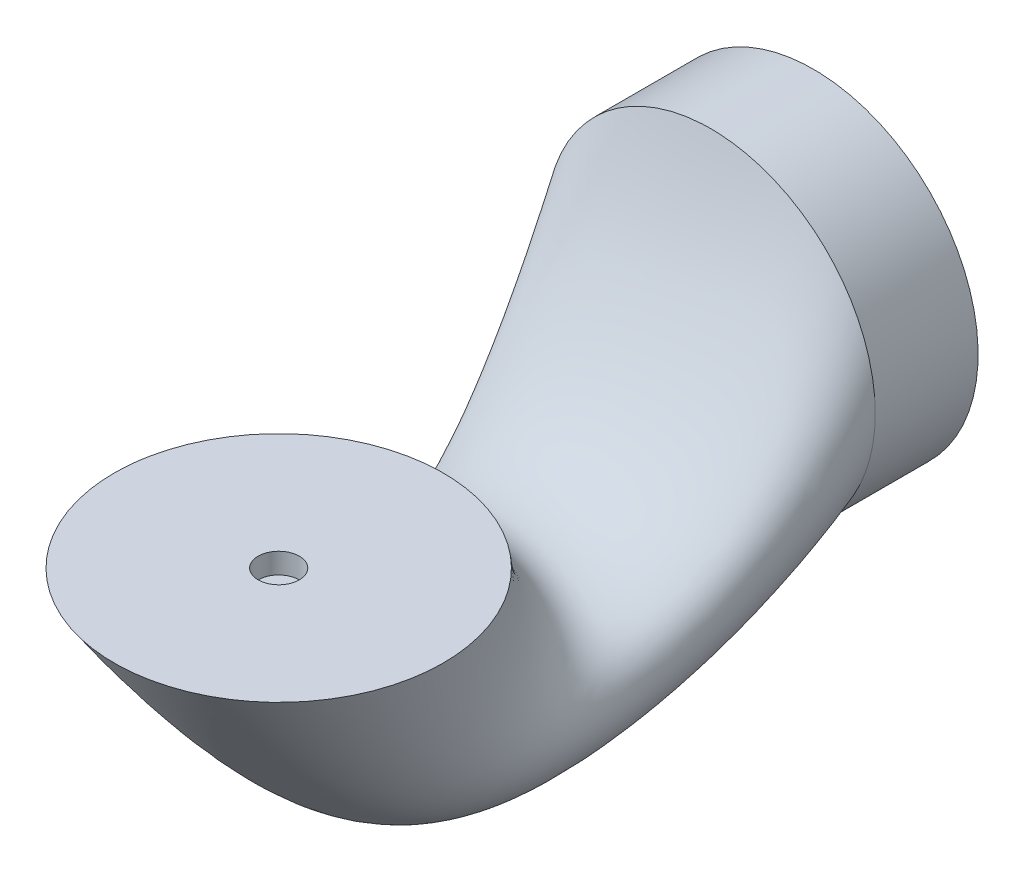
ISO-10303-21;
HEADER;
FILE_DESCRIPTION(('STEP AP214'),'2;1');
FILE_NAME('part.step','',(''),(''),'','','');
FILE_SCHEMA(('AUTOMOTIVE_DESIGN { 1 0 10303 214 1 1 1 1 }'));
ENDSEC;
DATA;
#1=APPLICATION_CONTEXT('core data for automotive mechanical design processes');
#2=APPLICATION_PROTOCOL_DEFINITION('international standard','automotive_design',2000,#1);
#3=PRODUCT_CONTEXT('',#1,'mechanical');
#4=PRODUCT('Part','Part','',(#3));
#5=PRODUCT_RELATED_PRODUCT_CATEGORY('part','',(#4));
#6=PRODUCT_DEFINITION_FORMATION('','',#4);
#7=PRODUCT_DEFINITION_CONTEXT('part definition',#1,'design');
#8=PRODUCT_DEFINITION('design','',#6,#7);
#9=PRODUCT_DEFINITION_SHAPE('','',#8);
#10=(LENGTH_UNIT() NAMED_UNIT(*) SI_UNIT(.MILLI.,.METRE.));
#11=(NAMED_UNIT(*) PLANE_ANGLE_UNIT() SI_UNIT($,.RADIAN.));
#12=(NAMED_UNIT(*) SI_UNIT($,.STERADIAN.) SOLID_ANGLE_UNIT());
#13=UNCERTAINTY_MEASURE_WITH_UNIT(LENGTH_MEASURE(1.E-05),#10,'distance_accuracy_value','');
#14=(GEOMETRIC_REPRESENTATION_CONTEXT(3) GLOBAL_UNCERTAINTY_ASSIGNED_CONTEXT((#13)) GLOBAL_UNIT_ASSIGNED_CONTEXT((#10,
#11,#12)) REPRESENTATION_CONTEXT('',''));
#15=CARTESIAN_POINT('',(0.,0.,0.));
#16=DIRECTION('',(0.,0.,1.));
#17=DIRECTION('',(1.,0.,0.));
#18=AXIS2_PLACEMENT_3D('',#15,#16,#17);
#19=CARTESIAN_POINT('',(0.,0.,260.));
#20=DIRECTION('',(0.,1.,0.));
#21=DIRECTION('',(0.,0.,1.));
#22=AXIS2_PLACEMENT_3D('',#19,#20,#21);
#23=PLANE('',#22);
#24=CARTESIAN_POINT('',(0.,0.,260.));
#25=DIRECTION('',(0.,1.,0.));
#26=DIRECTION('',(0.,0.,1.));
#27=AXIS2_PLACEMENT_3D('',#24,#25,#26);
#28=CIRCLE('',#27,10.);
#29=CARTESIAN_POINT('',(0.,0.,270.));
#30=VERTEX_POINT('',#29);
#31=EDGE_CURVE('E111',#30,#30,#28,.T.);
#32=ORIENTED_EDGE('',*,*,#31,.F.);
#33=EDGE_LOOP('',(#32));
#34=FACE_BOUND('',#33,.T.);
#35=CARTESIAN_POINT('',(-78.4955339615384,0.,244.558136508408));
#36=CARTESIAN_POINT('',(-78.2907679151548,0.,243.517250467884));
#37=CARTESIAN_POINT('',(-77.8407206554618,0.,241.447868670442));
#38=CARTESIAN_POINT('',(-77.0461181703535,0.,238.383994638859));
#39=CARTESIAN_POINT('',(-76.1339979948852,0.,235.363347085615));
#40=CARTESIAN_POINT('',(-69.9682542311678,0.,217.516987518738));
#41=CARTESIAN_POINT('',(-58.6786225704238,0.,203.035847137751));
#42=CARTESIAN_POINT('',(-26.9694972149722,0.,181.751706899031));
#43=CARTESIAN_POINT('',(-5.37585731888476,0.,177.40914511079));
#44=CARTESIAN_POINT('',(36.2595843020694,0.,185.599786966134));
#45=CARTESIAN_POINT('',(54.59924839128,0.,197.798141278971));
#46=CARTESIAN_POINT('',(78.2482931009694,0.,233.030502785028));
#47=CARTESIAN_POINT('',(82.5908548892102,0.,254.624142681115));
#48=CARTESIAN_POINT('',(74.4002130338665,0.,296.259584302069));
#49=CARTESIAN_POINT('',(62.2018587210295,0.,314.59924839128));
#50=CARTESIAN_POINT('',(26.9694972149722,0.,338.248293100969));
#51=CARTESIAN_POINT('',(5.37585731888471,0.,342.59085488921));
#52=CARTESIAN_POINT('',(-36.2595843020695,0.,334.400213033867));
#53=CARTESIAN_POINT('',(-54.59924839128,0.,322.201858721029));
#54=CARTESIAN_POINT('',(-75.8833886300005,0.,290.492733365578));
#55=CARTESIAN_POINT('',(-80.8464994463279,0.,272.814307508224));
#56=CARTESIAN_POINT('',(-79.7928337689043,0.,253.962285479001));
#57=CARTESIAN_POINT('',(-79.4928054067643,0.,250.821225492734));
#58=CARTESIAN_POINT('',(-79.0676426871096,0.,247.684674225407));
#59=CARTESIAN_POINT('',(-78.700300007922,0.,245.599022548932));
#60=CARTESIAN_POINT('',(-78.4955339615384,0.,244.558136508408));
#61=B_SPLINE_CURVE_WITH_KNOTS('',3,(#35,#36,#37,#38,#39,#40,#41,#42,#43,#44,#45,#46,#47,#48,#49,
#50,#51,#52,#53,#54,#55,#56,#57,#58,#59,#60),.UNSPECIFIED.,.T.,.F.,(4,1,1,1,1,2,2,2,2,2,2,2,1,1,
1,1,4),(0.,0.00624999999999998,0.0125,0.01875,0.025,0.125,0.25,0.375,0.5,0.625,0.75,0.875,0.975,
0.98125,0.9875,0.99375,1.),.UNSPECIFIED.);
#62=CARTESIAN_POINT('',(-78.4955339615384,0.,244.558136508408));
#63=VERTEX_POINT('',#62);
#64=EDGE_CURVE('E12',#63,#63,#61,.F.);
#65=ORIENTED_EDGE('',*,*,#64,.T.);
#66=EDGE_LOOP('',(#65));
#67=FACE_BOUND('',#66,.T.);
#68=ADVANCED_FACE('F88',(#34,#67),#23,.T.);
#69=CARTESIAN_POINT('',(-4.26953224874579,79.8859880978943,50.));
#70=CARTESIAN_POINT('',(-7.34343946329563,12.8035084154886,69.0625660595359));
#71=CARTESIAN_POINT('',(-23.8165774564036,-69.0081449852931,123.299829978158));
#72=CARTESIAN_POINT('',(-56.8274406051574,-40.4538169831076,198.767990398475));
#73=CARTESIAN_POINT('',(-78.4955339615384,0.,244.558136508408));
#74=CARTESIAN_POINT('',(-5.32885633570974,79.8293721824021,50.));
#75=CARTESIAN_POINT('',(-8.34136297329252,12.5627547807285,69.1167472826375));
#76=CARTESIAN_POINT('',(-24.5260193105289,-69.3461713435513,123.40562806979));
#77=CARTESIAN_POINT('',(-57.2553238636545,-40.6568044871035,199.516503559428));
#78=CARTESIAN_POINT('',(-78.700300007922,0.,245.599022548932));
#79=CARTESIAN_POINT('',(-7.44092455179814,79.6742870118411,50.));
#80=CARTESIAN_POINT('',(-10.3274748854592,12.0466123955639,69.2389199932643));
#81=CARTESIAN_POINT('',(-25.9305895102461,-70.0399849657422,123.639357028166));
#82=CARTESIAN_POINT('',(-58.0787839195589,-41.0695935735281,201.028507314354));
#83=CARTESIAN_POINT('',(-79.0676426871096,0.,247.684674225407));
#84=CARTESIAN_POINT('',(-10.5860064546738,79.3176681467285,50.));
#85=CARTESIAN_POINT('',(-13.2751453085567,11.1735464326681,69.4623377680111));
#86=CARTESIAN_POINT('',(-27.9945023466145,-71.1356188696474,124.052818113652));
#87=CARTESIAN_POINT('',(-59.212940976331,-41.7048810816121,203.343227132382));
#88=CARTESIAN_POINT('',(-79.4928054067643,0.,250.821225492734));
#89=CARTESIAN_POINT('',(-13.7047873885539,78.8386270818031,50.));
#90=CARTESIAN_POINT('',(-16.187639842738,10.2030874495888,69.7260236594389));
#91=CARTESIAN_POINT('',(-30.0134866003312,-72.283866123588,124.5282647009));
#92=CARTESIAN_POINT('',(-60.2464550202236,-42.3560543112372,205.700786664429));
#93=CARTESIAN_POINT('',(-79.7928337689043,0.,253.962285479001));
#94=CARTESIAN_POINT('',(-32.2399838914289,75.2392609501237,50.));
#95=CARTESIAN_POINT('',(-33.435610196774,3.81047549071332,71.5405573616998));
#96=CARTESIAN_POINT('',(-41.8484395099821,-79.4832518251466,127.748525593919));
#97=CARTESIAN_POINT('',(-65.8369655747833,-46.3474851615087,220.085720267862));
#98=CARTESIAN_POINT('',(-80.8464994463279,0.,272.814307508224));
#99=CARTESIAN_POINT('',(-48.162591149811,66.0943285903719,50.));
#100=CARTESIAN_POINT('',(-47.6460515466437,-6.6928558621089,75.276035744811));
#101=CARTESIAN_POINT('',(-50.724370944086,-88.6596427463466,133.567648818173));
#102=CARTESIAN_POINT('',(-66.2362794437871,-50.8134401766235,235.521341247316));
#103=CARTESIAN_POINT('',(-75.8833886300005,0.,290.492733365578));
#104=CARTESIAN_POINT('',(-73.6873740633674,37.6871338375442,50.));
#105=CARTESIAN_POINT('',(-69.2431002992718,-34.4295819405101,85.0895946247759));
#106=CARTESIAN_POINT('',(-62.2212305936391,-110.861182683761,150.658181055522));
#107=CARTESIAN_POINT('',(-56.3805628799422,-59.4822145977061,266.661479698646));
#108=CARTESIAN_POINT('',(-54.59924839128,0.,322.201858721029));
#109=CARTESIAN_POINT('',(-81.0183064077394,16.916949490533,50.));
#110=CARTESIAN_POINT('',(-74.1822559844138,-52.3640348664435,91.8631926613331));
#111=CARTESIAN_POINT('',(-62.7966144724955,-123.89694627022,162.508356824406));
#112=CARTESIAN_POINT('',(-44.4405097294273,-63.7506017194787,281.446842848831));
#113=CARTESIAN_POINT('',(-36.2595843020695,0.,334.400213033867));
#114=CARTESIAN_POINT('',(-78.7536697880493,-25.4560139880243,50.));
#115=CARTESIAN_POINT('',(-69.2668770629814,-86.5073850129919,103.591401839656));
#116=CARTESIAN_POINT('',(-51.3059404745315,-145.079076763309,186.812057019656));
#117=CARTESIAN_POINT('',(-13.0831238428986,-69.4281084949625,298.668463600876));
#118=CARTESIAN_POINT('',(5.37585731888471,0.,342.59085488921));
#119=CARTESIAN_POINT('',(-69.2506835629082,-45.3265041594159,50.));
#120=CARTESIAN_POINT('',(-59.5049251953282,-100.983993273452,108.546012981422));
#121=CARTESIAN_POINT('',(-39.5153942279425,-152.372528921162,197.851243755201));
#122=CARTESIAN_POINT('',(4.63207125745905,-70.8372281486738,300.769871871987));
#123=CARTESIAN_POINT('',(26.9694972149722,0.,338.248293100969));
#124=CARTESIAN_POINT('',(-37.6871338375441,-73.6873740633674,50.));
#125=CARTESIAN_POINT('',(-29.7985042731117,-119.621657886471,114.421506972988));
#126=CARTESIAN_POINT('',(-9.24767147613107,-156.466505798452,213.011608629719));
#127=CARTESIAN_POINT('',(36.8039481650703,-70.4258375293944,290.762675743922));
#128=CARTESIAN_POINT('',(62.2018587210295,0.,314.59924839128));
#129=CARTESIAN_POINT('',(-16.9169494905329,-81.0183064077394,50.));
#130=CARTESIAN_POINT('',(-11.1444143717603,-122.623266850842,115.342389822788));
#131=CARTESIAN_POINT('',(8.09702240621196,-153.282295716753,216.088066599046));
#132=CARTESIAN_POINT('',(49.8202626751911,-68.6053272564037,279.620890176983));
#133=CARTESIAN_POINT('',(74.4002130338665,0.,296.259584302069));
#134=CARTESIAN_POINT('',(25.4560139880244,-78.7536697880492,50.));
#135=CARTESIAN_POINT('',(26.5118398559727,-115.584642754262,111.625211720417));
#136=CARTESIAN_POINT('',(38.8490081020253,-137.138591427869,213.532838178717));
#137=CARTESIAN_POINT('',(64.5151650927447,-63.0879315515077,247.935862688346));
#138=CARTESIAN_POINT('',(82.5908548892102,0.,254.624142681115));
#139=CARTESIAN_POINT('',(45.3265041594159,-69.2506835629082,50.));
#140=CARTESIAN_POINT('',(43.7817152221998,-105.636992432232,106.987150768245));
#141=CARTESIAN_POINT('',(50.9302392612991,-125.053600220726,207.838032047081));
#142=CARTESIAN_POINT('',(65.8589036694298,-59.3910461196024,229.094758402304));
#143=CARTESIAN_POINT('',(78.2482931009694,0.,233.030502785028));
#144=CARTESIAN_POINT('',(73.6873740633674,-37.687133837544,50.));
#145=CARTESIAN_POINT('',(70.040055496663,-74.8173262342389,96.2957893702281));
#146=CARTESIAN_POINT('',(61.4120962354018,-100.378615276172,188.61470729112));
#147=CARTESIAN_POINT('',(57.1853092290769,-49.7713942799001,194.740611112167));
#148=CARTESIAN_POINT('',(54.59924839128,0.,197.798141278971));
#149=CARTESIAN_POINT('',(81.0183064077394,-16.9169494905328,50.));
#150=CARTESIAN_POINT('',(77.8690730167113,-55.2356895114884,90.2424889243837));
#151=CARTESIAN_POINT('',(59.0698717114161,-89.0100903428908,176.041644041279));
#152=CARTESIAN_POINT('',(48.1347950442769,-43.8486278721032,180.667935405206));
#153=CARTESIAN_POINT('',(36.2595843020694,0.,185.599786966134));
#154=CARTESIAN_POINT('',(78.7536697880492,25.4560139880245,50.));
#155=CARTESIAN_POINT('',(75.0895507540866,-18.5962040986961,80.1837294776222));
#156=CARTESIAN_POINT('',(45.4312781915232,-70.3476530722281,150.062810400099));
#157=CARTESIAN_POINT('',(18.8983292514516,-35.6759754030756,165.097571048082));
#158=CARTESIAN_POINT('',(-5.37585731888476,0.,177.40914511079));
#159=CARTESIAN_POINT('',(69.2506835629081,45.326504159416,50.));
#160=CARTESIAN_POINT('',(64.5735937103349,-3.27064436880899,76.178270476705));
#161=CARTESIAN_POINT('',(34.4104208258474,-63.9066554836227,138.071377699581));
#162=CARTESIAN_POINT('',(0.414515279082568,-33.4260893418451,163.934731728669));
#163=CARTESIAN_POINT('',(-26.9694972149722,0.,181.751706899031));
#164=CARTESIAN_POINT('',(40.8434888100803,70.8512870729723,50.));
#165=CARTESIAN_POINT('',(35.9005236225508,13.5227992072287,70.6255527737681));
#166=CARTESIAN_POINT('',(9.10265084895997,-60.2507867579805,124.674029995376));
#167=CARTESIAN_POINT('',(-30.4377176343195,-33.7611717480125,172.711858876848));
#168=CARTESIAN_POINT('',(-58.6786225704238,0.,203.035847137751));
#169=CARTESIAN_POINT('',(24.0368617274568,78.2469950089811,50.));
#170=CARTESIAN_POINT('',(19.5567226618698,16.5874214065698,68.6294548468954));
#171=CARTESIAN_POINT('',(-4.1446824391769,-61.5127963662088,122.150868398515));
#172=CARTESIAN_POINT('',(-43.11367234745,-35.5759143148915,180.30571088408));
#173=CARTESIAN_POINT('',(-69.9682542311678,0.,217.516987518738));
#174=CARTESIAN_POINT('',(5.22360886715598,79.8502612889403,50.));
#175=CARTESIAN_POINT('',(1.63989275889863,14.5067633635921,68.7540735092863));
#176=CARTESIAN_POINT('',(-17.3366615802015,-66.245936552622,122.637398128114));
#177=CARTESIAN_POINT('',(-52.5984917479122,-38.7267920818857,192.329711925566));
#178=CARTESIAN_POINT('',(-76.1339979948852,0.,235.363347085615));
#179=CARTESIAN_POINT('',(2.07153501068136,79.9941545088918,50.));
#180=CARTESIAN_POINT('',(-1.35263785896672,14.0521903706493,68.8134714029416));
#181=CARTESIAN_POINT('',(-19.5184400630412,-67.0987634517492,122.787434316199));
#182=CARTESIAN_POINT('',(-54.0977840238306,-39.2772356272536,194.402734255248));
#183=CARTESIAN_POINT('',(-77.0461181703535,0.,238.383994638859));
#184=CARTESIAN_POINT('',(-1.09364147481536,80.0135195911,50.));
#185=CARTESIAN_POINT('',(-4.34859527027869,13.4906712904292,68.9138326546547));
#186=CARTESIAN_POINT('',(-21.6805686887652,-68.0161993311932,123.004252879662));
#187=CARTESIAN_POINT('',(-55.5131586152305,-39.8516685495529,196.545939036813));
#188=CARTESIAN_POINT('',(-77.8407206554618,0.,241.447868670442));
#189=CARTESIAN_POINT('',(-3.21020816178187,79.9426040133866,50.));
#190=CARTESIAN_POINT('',(-6.34551595329876,13.0442620502486,69.0083848364343));
#191=CARTESIAN_POINT('',(-23.1071356022783,-68.6701186270349,123.194031886526));
#192=CARTESIAN_POINT('',(-56.3995573466604,-40.2508294791118,198.019477237521));
#193=CARTESIAN_POINT('',(-78.2907679151548,0.,243.517250467884));
#194=CARTESIAN_POINT('',(-4.26953224874579,79.8859880978943,50.));
#195=CARTESIAN_POINT('',(-7.34343946329563,12.8035084154886,69.0625660595359));
#196=CARTESIAN_POINT('',(-23.8165774564036,-69.0081449852931,123.299829978158));
#197=CARTESIAN_POINT('',(-56.8274406051574,-40.4538169831076,198.767990398475));
#198=CARTESIAN_POINT('',(-78.4955339615384,0.,244.558136508408));
#199=B_SPLINE_SURFACE_WITH_KNOTS('',3,3,((#69,#70,#71,#72,#73),(#74,#75,#76,#77,#78),(#79,#80,
#81,#82,#83),(#84,#85,#86,#87,#88),(#89,#90,#91,#92,#93),(#94,#95,#96,#97,#98),(#99,#100,#101,
#102,#103),(#104,#105,#106,#107,#108),(#109,#110,#111,#112,#113),(#114,#115,#116,#117,#118),
(#119,#120,#121,#122,#123),(#124,#125,#126,#127,#128),(#129,#130,#131,#132,#133),(#134,#135,
#136,#137,#138),(#139,#140,#141,#142,#143),(#144,#145,#146,#147,#148),(#149,#150,#151,#152,
#153),(#154,#155,#156,#157,#158),(#159,#160,#161,#162,#163),(#164,#165,#166,#167,#168),(#169,
#170,#171,#172,#173),(#174,#175,#176,#177,#178),(#179,#180,#181,#182,#183),(#184,#185,#186,#187,
#188),(#189,#190,#191,#192,#193),(#194,#195,#196,#197,#198)),.UNSPECIFIED.,.T.,.F.,.F.,(4,1,1,1,
1,2,2,2,2,2,2,2,1,1,1,1,4),(4,1,4),(0.,0.00625000000000009,0.0125,0.01875,0.0249999999999999,
0.125,0.25,0.375,0.5,0.625,0.75,0.875,0.975,0.98125,0.9875,0.99375,1.),(0.,0.53467536756128,1.),.UNSPECIFIED.);
#200=CARTESIAN_POINT('',(-4.26953224874579,79.8859880978943,50.));
#201=CARTESIAN_POINT('',(-5.32885633570974,79.8293721824021,50.));
#202=CARTESIAN_POINT('',(-7.44092455179814,79.6742870118411,50.));
#203=CARTESIAN_POINT('',(-10.5860064546738,79.3176681467285,50.));
#204=CARTESIAN_POINT('',(-13.7047873885539,78.8386270818031,50.));
#205=CARTESIAN_POINT('',(-32.2399838914289,75.2392609501237,50.));
#206=CARTESIAN_POINT('',(-48.162591149811,66.0943285903719,50.));
#207=CARTESIAN_POINT('',(-73.6873740633674,37.6871338375442,50.));
#208=CARTESIAN_POINT('',(-81.0183064077394,16.916949490533,50.));
#209=CARTESIAN_POINT('',(-78.7536697880493,-25.4560139880243,50.));
#210=CARTESIAN_POINT('',(-69.2506835629082,-45.3265041594159,50.));
#211=CARTESIAN_POINT('',(-37.6871338375441,-73.6873740633674,50.));
#212=CARTESIAN_POINT('',(-16.9169494905329,-81.0183064077394,50.));
#213=CARTESIAN_POINT('',(25.4560139880244,-78.7536697880492,50.));
#214=CARTESIAN_POINT('',(45.3265041594159,-69.2506835629082,50.));
#215=CARTESIAN_POINT('',(73.6873740633674,-37.687133837544,50.));
#216=CARTESIAN_POINT('',(81.0183064077394,-16.9169494905328,50.));
#217=CARTESIAN_POINT('',(78.7536697880492,25.4560139880245,50.));
#218=CARTESIAN_POINT('',(69.2506835629081,45.326504159416,50.));
#219=CARTESIAN_POINT('',(40.8434888100803,70.8512870729723,50.));
#220=CARTESIAN_POINT('',(24.0368617274568,78.2469950089811,50.));
#221=CARTESIAN_POINT('',(5.22360886715598,79.8502612889403,50.));
#222=CARTESIAN_POINT('',(2.07153501068136,79.9941545088918,50.));
#223=CARTESIAN_POINT('',(-1.09364147481536,80.0135195911,50.));
#224=CARTESIAN_POINT('',(-3.21020816178187,79.9426040133866,50.));
#225=CARTESIAN_POINT('',(-4.26953224874579,79.8859880978943,50.));
#226=B_SPLINE_CURVE_WITH_KNOTS('',3,(#200,#201,#202,#203,#204,#205,#206,#207,#208,#209,#210,
#211,#212,#213,#214,#215,#216,#217,#218,#219,#220,#221,#222,#223,#224,#225),.UNSPECIFIED.,.T.,
.F.,(4,1,1,1,1,2,2,2,2,2,2,2,1,1,1,1,4),(0.,0.00625000000000009,0.0125,0.01875,
0.0249999999999999,0.125,0.25,0.375,0.5,0.625,0.75,0.875,0.975,0.98125,0.9875,0.99375,1.),.UNSPECIFIED.);
#227=CARTESIAN_POINT('',(-4.26953224874579,79.8859880978943,50.));
#228=VERTEX_POINT('',#227);
#229=EDGE_CURVE('E117',#228,#228,#226,.T.);
#230=ORIENTED_EDGE('',*,*,#229,.T.);
#231=EDGE_LOOP('',(#230));
#232=FACE_BOUND('',#231,.T.);
#233=ORIENTED_EDGE('',*,*,#64,.F.);
#234=EDGE_LOOP('',(#233));
#235=FACE_BOUND('',#234,.T.);
#236=ADVANCED_FACE('F138',(#232,#235),#199,.T.);
#237=CARTESIAN_POINT('',(0.,-10.,260.));
#238=DIRECTION('',(0.,1.,0.));
#239=DIRECTION('',(0.,0.,1.));
#240=AXIS2_PLACEMENT_3D('',#237,#238,#239);
#241=CYLINDRICAL_SURFACE('',#240,10.);
#242=CARTESIAN_POINT('',(0.,-10.,260.));
#243=DIRECTION('',(0.,1.,0.));
#244=DIRECTION('',(0.,0.,1.));
#245=AXIS2_PLACEMENT_3D('',#242,#243,#244);
#246=CIRCLE('',#245,10.);
#247=CARTESIAN_POINT('',(0.,-10.,270.));
#248=VERTEX_POINT('',#247);
#249=EDGE_CURVE('E106',#248,#248,#246,.T.);
#250=ORIENTED_EDGE('',*,*,#249,.F.);
#251=EDGE_LOOP('',(#250));
#252=FACE_BOUND('',#251,.T.);
#253=ORIENTED_EDGE('',*,*,#31,.T.);
#254=EDGE_LOOP('',(#253));
#255=FACE_BOUND('',#254,.T.);
#256=ADVANCED_FACE('F141',(#252,#255),#241,.F.);
#257=CARTESIAN_POINT('',(0.,-10.,260.));
#258=DIRECTION('',(0.,1.,0.));
#259=DIRECTION('',(0.,0.,1.));
#260=AXIS2_PLACEMENT_3D('',#257,#258,#259);
#261=PLANE('',#260);
#262=ORIENTED_EDGE('',*,*,#249,.T.);
#263=EDGE_LOOP('',(#262));
#264=FACE_BOUND('',#263,.T.);
#265=ADVANCED_FACE('F137',(#264),#261,.T.);
#266=CARTESIAN_POINT('',(0.,0.,0.));
#267=DIRECTION('',(0.,0.,1.));
#268=DIRECTION('',(1.,0.,0.));
#269=AXIS2_PLACEMENT_3D('',#266,#267,#268);
#270=CYLINDRICAL_SURFACE('',#269,80.);
#271=CARTESIAN_POINT('',(0.,0.,0.));
#272=DIRECTION('',(0.,0.,-1.));
#273=DIRECTION('',(-1.,0.,0.));
#274=AXIS2_PLACEMENT_3D('',#271,#272,#273);
#275=CIRCLE('',#274,80.);
#276=CARTESIAN_POINT('',(-80.,0.,0.));
#277=VERTEX_POINT('',#276);
#278=EDGE_CURVE('E112',#277,#277,#275,.T.);
#279=ORIENTED_EDGE('',*,*,#278,.F.);
#280=EDGE_LOOP('',(#279));
#281=FACE_BOUND('',#280,.T.);
#282=ORIENTED_EDGE('',*,*,#229,.F.);
#283=EDGE_LOOP('',(#282));
#284=FACE_BOUND('',#283,.T.);
#285=ADVANCED_FACE('F123',(#281,#284),#270,.T.);
#286=CARTESIAN_POINT('',(0.,0.,0.));
#287=DIRECTION('',(0.,0.,-1.));
#288=DIRECTION('',(-1.,0.,0.));
#289=AXIS2_PLACEMENT_3D('',#286,#287,#288);
#290=PLANE('',#289);
#291=CARTESIAN_POINT('',(0.,0.,0.));
#292=DIRECTION('',(0.,0.,-1.));
#293=DIRECTION('',(-1.,0.,0.));
#294=AXIS2_PLACEMENT_3D('',#291,#292,#293);
#295=CIRCLE('',#294,10.);
#296=CARTESIAN_POINT('',(-10.,0.,0.));
#297=VERTEX_POINT('',#296);
#298=EDGE_CURVE('E172',#297,#297,#295,.T.);
#299=ORIENTED_EDGE('',*,*,#298,.F.);
#300=EDGE_LOOP('',(#299));
#301=FACE_BOUND('',#300,.T.);
#302=ORIENTED_EDGE('',*,*,#278,.T.);
#303=EDGE_LOOP('',(#302));
#304=FACE_BOUND('',#303,.T.);
#305=ADVANCED_FACE('F134',(#301,#304),#290,.T.);
#306=CARTESIAN_POINT('',(0.,0.,10.));
#307=DIRECTION('',(0.,0.,-1.));
#308=DIRECTION('',(-1.,0.,0.));
#309=AXIS2_PLACEMENT_3D('',#306,#307,#308);
#310=CYLINDRICAL_SURFACE('',#309,10.);
#311=CARTESIAN_POINT('',(0.,0.,10.));
#312=DIRECTION('',(0.,0.,-1.));
#313=DIRECTION('',(-1.,0.,0.));
#314=AXIS2_PLACEMENT_3D('',#311,#312,#313);
#315=CIRCLE('',#314,10.);
#316=CARTESIAN_POINT('',(-10.,0.,10.));
#317=VERTEX_POINT('',#316);
#318=EDGE_CURVE('E198',#317,#317,#315,.T.);
#319=ORIENTED_EDGE('',*,*,#318,.F.);
#320=EDGE_LOOP('',(#319));
#321=FACE_BOUND('',#320,.T.);
#322=ORIENTED_EDGE('',*,*,#298,.T.);
#323=EDGE_LOOP('',(#322));
#324=FACE_BOUND('',#323,.T.);
#325=ADVANCED_FACE('F155',(#321,#324),#310,.F.);
#326=CARTESIAN_POINT('',(0.,0.,10.));
#327=DIRECTION('',(0.,0.,-1.));
#328=DIRECTION('',(-1.,0.,0.));
#329=AXIS2_PLACEMENT_3D('',#326,#327,#328);
#330=PLANE('',#329);
#331=ORIENTED_EDGE('',*,*,#318,.T.);
#332=EDGE_LOOP('',(#331));
#333=FACE_BOUND('',#332,.T.);
#334=ADVANCED_FACE('F195',(#333),#330,.T.);
#335=CLOSED_SHELL('',(#68,#236,#256,#265,#285,#305,#325,#334));
#336=CARTESIAN_POINT('',(0.,0.,60.));
#337=DIRECTION('',(0.,0.,-1.));
#338=DIRECTION('',(-1.,0.,0.));
#339=AXIS2_PLACEMENT_3D('',#336,#337,#338);
#340=PLANE('',#339);
#341=CARTESIAN_POINT('',(0.,0.,60.));
#342=DIRECTION('',(0.,0.,-1.));
#343=DIRECTION('',(-1.,0.,0.));
#344=AXIS2_PLACEMENT_3D('',#341,#342,#343);
#345=CIRCLE('',#344,10.);
#346=CARTESIAN_POINT('',(-10.,0.,60.));
#347=VERTEX_POINT('',#346);
#348=EDGE_CURVE('E100',#347,#347,#345,.T.);
#349=ORIENTED_EDGE('',*,*,#348,.T.);
#350=EDGE_LOOP('',(#349));
#351=FACE_BOUND('',#350,.T.);
#352=ADVANCED_FACE('F153',(#351),#340,.T.);
#353=CARTESIAN_POINT('',(0.,0.,60.));
#354=DIRECTION('',(0.,0.,-1.));
#355=DIRECTION('',(-1.,0.,0.));
#356=AXIS2_PLACEMENT_3D('',#353,#354,#355);
#357=CYLINDRICAL_SURFACE('',#356,10.);
#358=ORIENTED_EDGE('',*,*,#348,.F.);
#359=EDGE_LOOP('',(#358));
#360=FACE_BOUND('',#359,.T.);
#361=CARTESIAN_POINT('',(0.,0.,50.));
#362=DIRECTION('',(0.,0.,-1.));
#363=DIRECTION('',(-1.,0.,0.));
#364=AXIS2_PLACEMENT_3D('',#361,#362,#363);
#365=CIRCLE('',#364,10.);
#366=CARTESIAN_POINT('',(-10.,0.,50.));
#367=VERTEX_POINT('',#366);
#368=EDGE_CURVE('E93',#367,#367,#365,.T.);
#369=ORIENTED_EDGE('',*,*,#368,.T.);
#370=EDGE_LOOP('',(#369));
#371=FACE_BOUND('',#370,.T.);
#372=ADVANCED_FACE('F157',(#360,#371),#357,.F.);
#373=CARTESIAN_POINT('',(0.,0.,50.));
#374=DIRECTION('',(0.,0.,-1.));
#375=DIRECTION('',(-1.,0.,0.));
#376=AXIS2_PLACEMENT_3D('',#373,#374,#375);
#377=PLANE('',#376);
#378=ORIENTED_EDGE('',*,*,#368,.F.);
#379=EDGE_LOOP('',(#378));
#380=FACE_BOUND('',#379,.T.);
#381=ADVANCED_FACE('F92',(#380),#377,.F.);
#382=CLOSED_SHELL('',(#352,#372,#381));
#383=ORIENTED_CLOSED_SHELL('',*,#382,.T.);
#384=BREP_WITH_VOIDS('B2',#335,(#383));
#385=ADVANCED_BREP_SHAPE_REPRESENTATION('',(#18,#384),#14);
#386=SHAPE_DEFINITION_REPRESENTATION(#9,#385);
ENDSEC;
END-ISO-10303-21;
